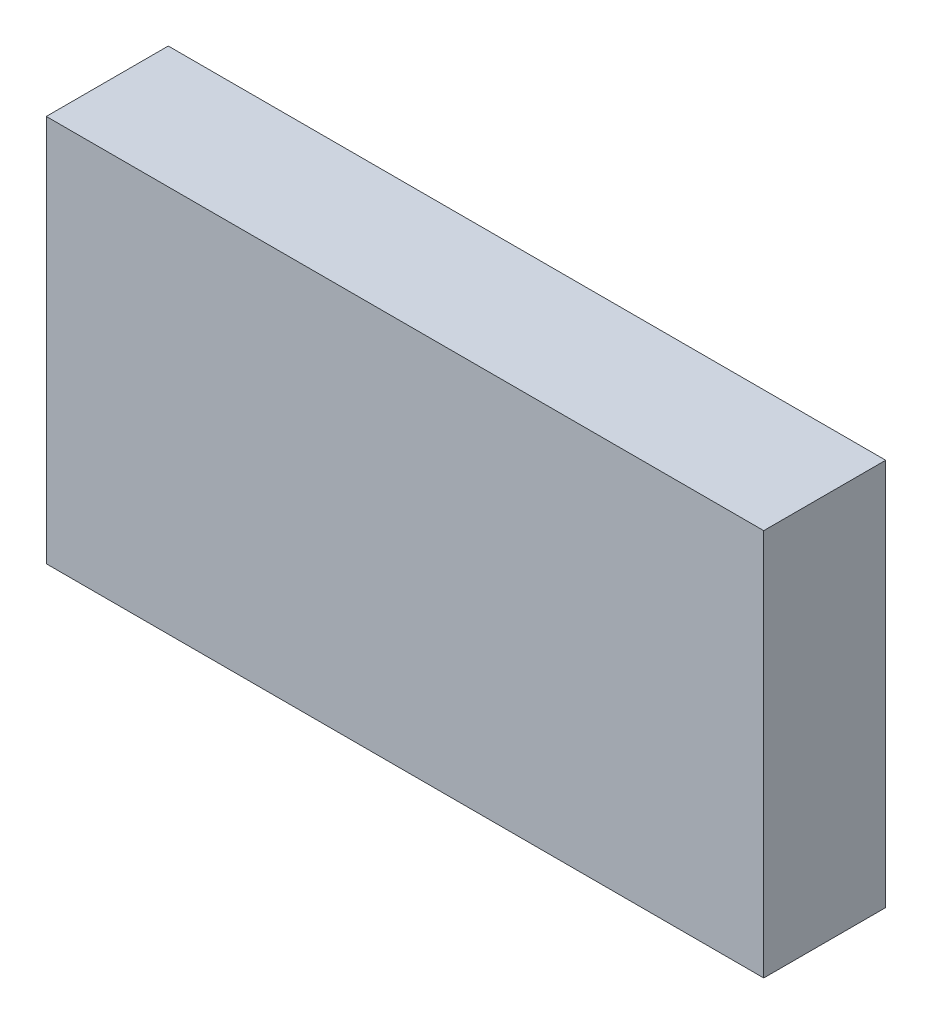
ISO-10303-21;
HEADER;
FILE_DESCRIPTION(('STEP AP214'),'2;1');
FILE_NAME('part.step','',(''),(''),'','','');
FILE_SCHEMA(('AUTOMOTIVE_DESIGN { 1 0 10303 214 1 1 1 1 }'));
ENDSEC;
DATA;
#1=APPLICATION_CONTEXT('core data for automotive mechanical design processes');
#2=APPLICATION_PROTOCOL_DEFINITION('international standard','automotive_design',2000,#1);
#3=PRODUCT_CONTEXT('',#1,'mechanical');
#4=PRODUCT('Part','Part','',(#3));
#5=PRODUCT_RELATED_PRODUCT_CATEGORY('part','',(#4));
#6=PRODUCT_DEFINITION_FORMATION('','',#4);
#7=PRODUCT_DEFINITION_CONTEXT('part definition',#1,'design');
#8=PRODUCT_DEFINITION('design','',#6,#7);
#9=PRODUCT_DEFINITION_SHAPE('','',#8);
#10=(LENGTH_UNIT() NAMED_UNIT(*) SI_UNIT(.MILLI.,.METRE.));
#11=(NAMED_UNIT(*) PLANE_ANGLE_UNIT() SI_UNIT($,.RADIAN.));
#12=(NAMED_UNIT(*) SI_UNIT($,.STERADIAN.) SOLID_ANGLE_UNIT());
#13=UNCERTAINTY_MEASURE_WITH_UNIT(LENGTH_MEASURE(1.E-05),#10,'distance_accuracy_value','');
#14=(GEOMETRIC_REPRESENTATION_CONTEXT(3) GLOBAL_UNCERTAINTY_ASSIGNED_CONTEXT((#13)) GLOBAL_UNIT_ASSIGNED_CONTEXT((#10,
#11,#12)) REPRESENTATION_CONTEXT('',''));
#15=CARTESIAN_POINT('',(0.,0.,0.));
#16=DIRECTION('',(0.,0.,1.));
#17=DIRECTION('',(1.,0.,0.));
#18=AXIS2_PLACEMENT_3D('',#15,#16,#17);
#19=CARTESIAN_POINT('',(52.8433677550725,-10.4814925141854,17.));
#20=DIRECTION('',(-1.,0.,0.));
#21=DIRECTION('',(0.,0.,1.));
#22=AXIS2_PLACEMENT_3D('',#19,#20,#21);
#23=PLANE('',#22);
#24=DIRECTION('',(0.,1.,0.));
#25=VECTOR('',#24,1.);
#26=CARTESIAN_POINT('',(52.8433677550725,-10.4814925141854,0.));
#27=LINE('',#26,#25);
#28=CARTESIAN_POINT('',(52.8433677550725,-10.4814925141854,0.));
#29=VERTEX_POINT('',#28);
#30=CARTESIAN_POINT('',(52.8433677550725,43.5185074858146,0.));
#31=VERTEX_POINT('',#30);
#32=EDGE_CURVE('E102',#29,#31,#27,.T.);
#33=ORIENTED_EDGE('',*,*,#32,.T.);
#34=DIRECTION('',(0.,0.,-1.));
#35=VECTOR('',#34,1.);
#36=CARTESIAN_POINT('',(52.8433677550725,43.5185074858146,17.));
#37=LINE('',#36,#35);
#38=CARTESIAN_POINT('',(52.8433677550725,43.5185074858146,17.));
#39=VERTEX_POINT('',#38);
#40=EDGE_CURVE('E11',#39,#31,#37,.T.);
#41=ORIENTED_EDGE('',*,*,#40,.F.);
#42=DIRECTION('',(0.,1.,0.));
#43=VECTOR('',#42,1.);
#44=CARTESIAN_POINT('',(52.8433677550725,-10.4814925141854,17.));
#45=LINE('',#44,#43);
#46=CARTESIAN_POINT('',(52.8433677550725,-10.4814925141854,17.));
#47=VERTEX_POINT('',#46);
#48=EDGE_CURVE('E90',#47,#39,#45,.T.);
#49=ORIENTED_EDGE('',*,*,#48,.F.);
#50=DIRECTION('',(0.,0.,-1.));
#51=VECTOR('',#50,1.);
#52=CARTESIAN_POINT('',(52.8433677550725,-10.4814925141854,17.));
#53=LINE('',#52,#51);
#54=EDGE_CURVE('E98',#47,#29,#53,.T.);
#55=ORIENTED_EDGE('',*,*,#54,.T.);
#56=EDGE_LOOP('',(#33,#41,#49,#55));
#57=FACE_BOUND('',#56,.T.);
#58=ADVANCED_FACE('F39',(#57),#23,.F.);
#59=CARTESIAN_POINT('',(52.8433677550725,43.5185074858146,17.));
#60=DIRECTION('',(0.,-1.,0.));
#61=DIRECTION('',(1.,0.,0.));
#62=AXIS2_PLACEMENT_3D('',#59,#60,#61);
#63=PLANE('',#62);
#64=DIRECTION('',(-1.,0.,0.));
#65=VECTOR('',#64,1.);
#66=CARTESIAN_POINT('',(52.8433677550725,43.5185074858146,0.));
#67=LINE('',#66,#65);
#68=CARTESIAN_POINT('',(-47.1566322449275,43.5185074858146,0.));
#69=VERTEX_POINT('',#68);
#70=EDGE_CURVE('E94',#31,#69,#67,.T.);
#71=ORIENTED_EDGE('',*,*,#70,.T.);
#72=DIRECTION('',(0.,0.,-1.));
#73=VECTOR('',#72,1.);
#74=CARTESIAN_POINT('',(-47.1566322449275,43.5185074858146,17.));
#75=LINE('',#74,#73);
#76=CARTESIAN_POINT('',(-47.1566322449275,43.5185074858146,17.));
#77=VERTEX_POINT('',#76);
#78=EDGE_CURVE('E47',#77,#69,#75,.T.);
#79=ORIENTED_EDGE('',*,*,#78,.F.);
#80=DIRECTION('',(-1.,0.,0.));
#81=VECTOR('',#80,1.);
#82=CARTESIAN_POINT('',(52.8433677550725,43.5185074858146,17.));
#83=LINE('',#82,#81);
#84=EDGE_CURVE('E85',#39,#77,#83,.T.);
#85=ORIENTED_EDGE('',*,*,#84,.F.);
#86=ORIENTED_EDGE('',*,*,#40,.T.);
#87=EDGE_LOOP('',(#71,#79,#85,#86));
#88=FACE_BOUND('',#87,.T.);
#89=ADVANCED_FACE('F93',(#88),#63,.F.);
#90=CARTESIAN_POINT('',(-47.1566322449275,-10.4814925141854,17.));
#91=DIRECTION('',(1.,0.,0.));
#92=DIRECTION('',(0.,0.,-1.));
#93=AXIS2_PLACEMENT_3D('',#90,#91,#92);
#94=PLANE('',#93);
#95=DIRECTION('',(0.,-1.,0.));
#96=VECTOR('',#95,1.);
#97=CARTESIAN_POINT('',(-47.1566322449275,-10.4814925141854,0.));
#98=LINE('',#97,#96);
#99=CARTESIAN_POINT('',(-47.1566322449275,-10.4814925141854,0.));
#100=VERTEX_POINT('',#99);
#101=EDGE_CURVE('E72',#69,#100,#98,.T.);
#102=ORIENTED_EDGE('',*,*,#101,.T.);
#103=DIRECTION('',(0.,0.,-1.));
#104=VECTOR('',#103,1.);
#105=CARTESIAN_POINT('',(-47.1566322449275,-10.4814925141854,17.));
#106=LINE('',#105,#104);
#107=CARTESIAN_POINT('',(-47.1566322449275,-10.4814925141854,17.));
#108=VERTEX_POINT('',#107);
#109=EDGE_CURVE('E95',#108,#100,#106,.T.);
#110=ORIENTED_EDGE('',*,*,#109,.F.);
#111=DIRECTION('',(0.,-1.,0.));
#112=VECTOR('',#111,1.);
#113=CARTESIAN_POINT('',(-47.1566322449275,-10.4814925141854,17.));
#114=LINE('',#113,#112);
#115=EDGE_CURVE('E88',#77,#108,#114,.T.);
#116=ORIENTED_EDGE('',*,*,#115,.F.);
#117=ORIENTED_EDGE('',*,*,#78,.T.);
#118=EDGE_LOOP('',(#102,#110,#116,#117));
#119=FACE_BOUND('',#118,.T.);
#120=ADVANCED_FACE('F96',(#119),#94,.F.);
#121=CARTESIAN_POINT('',(52.8433677550725,-10.4814925141854,17.));
#122=DIRECTION('',(0.,1.,0.));
#123=DIRECTION('',(-1.,0.,0.));
#124=AXIS2_PLACEMENT_3D('',#121,#122,#123);
#125=PLANE('',#124);
#126=DIRECTION('',(1.,0.,0.));
#127=VECTOR('',#126,1.);
#128=CARTESIAN_POINT('',(52.8433677550725,-10.4814925141854,0.));
#129=LINE('',#128,#127);
#130=EDGE_CURVE('E78',#100,#29,#129,.T.);
#131=ORIENTED_EDGE('',*,*,#130,.T.);
#132=ORIENTED_EDGE('',*,*,#54,.F.);
#133=DIRECTION('',(1.,0.,0.));
#134=VECTOR('',#133,1.);
#135=CARTESIAN_POINT('',(52.8433677550725,-10.4814925141854,17.));
#136=LINE('',#135,#134);
#137=EDGE_CURVE('E55',#108,#47,#136,.T.);
#138=ORIENTED_EDGE('',*,*,#137,.F.);
#139=ORIENTED_EDGE('',*,*,#109,.T.);
#140=EDGE_LOOP('',(#131,#132,#138,#139));
#141=FACE_BOUND('',#140,.T.);
#142=ADVANCED_FACE('F109',(#141),#125,.F.);
#143=CARTESIAN_POINT('',(0.,0.,17.));
#144=DIRECTION('',(0.,0.,1.));
#145=DIRECTION('',(1.,0.,0.));
#146=AXIS2_PLACEMENT_3D('',#143,#144,#145);
#147=PLANE('',#146);
#148=ORIENTED_EDGE('',*,*,#48,.T.);
#149=ORIENTED_EDGE('',*,*,#84,.T.);
#150=ORIENTED_EDGE('',*,*,#115,.T.);
#151=ORIENTED_EDGE('',*,*,#137,.T.);
#152=EDGE_LOOP('',(#148,#149,#150,#151));
#153=FACE_BOUND('',#152,.T.);
#154=ADVANCED_FACE('F86',(#153),#147,.T.);
#155=CARTESIAN_POINT('',(0.,0.,0.));
#156=DIRECTION('',(0.,0.,1.));
#157=DIRECTION('',(1.,0.,0.));
#158=AXIS2_PLACEMENT_3D('',#155,#156,#157);
#159=PLANE('',#158);
#160=ORIENTED_EDGE('',*,*,#32,.F.);
#161=ORIENTED_EDGE('',*,*,#130,.F.);
#162=ORIENTED_EDGE('',*,*,#101,.F.);
#163=ORIENTED_EDGE('',*,*,#70,.F.);
#164=EDGE_LOOP('',(#160,#161,#162,#163));
#165=FACE_BOUND('',#164,.T.);
#166=ADVANCED_FACE('F112',(#165),#159,.F.);
#167=CLOSED_SHELL('',(#58,#89,#120,#142,#154,#166));
#168=MANIFOLD_SOLID_BREP('B2',#167);
#169=ADVANCED_BREP_SHAPE_REPRESENTATION('',(#18,#168),#14);
#170=SHAPE_DEFINITION_REPRESENTATION(#9,#169);
ENDSEC;
END-ISO-10303-21;
